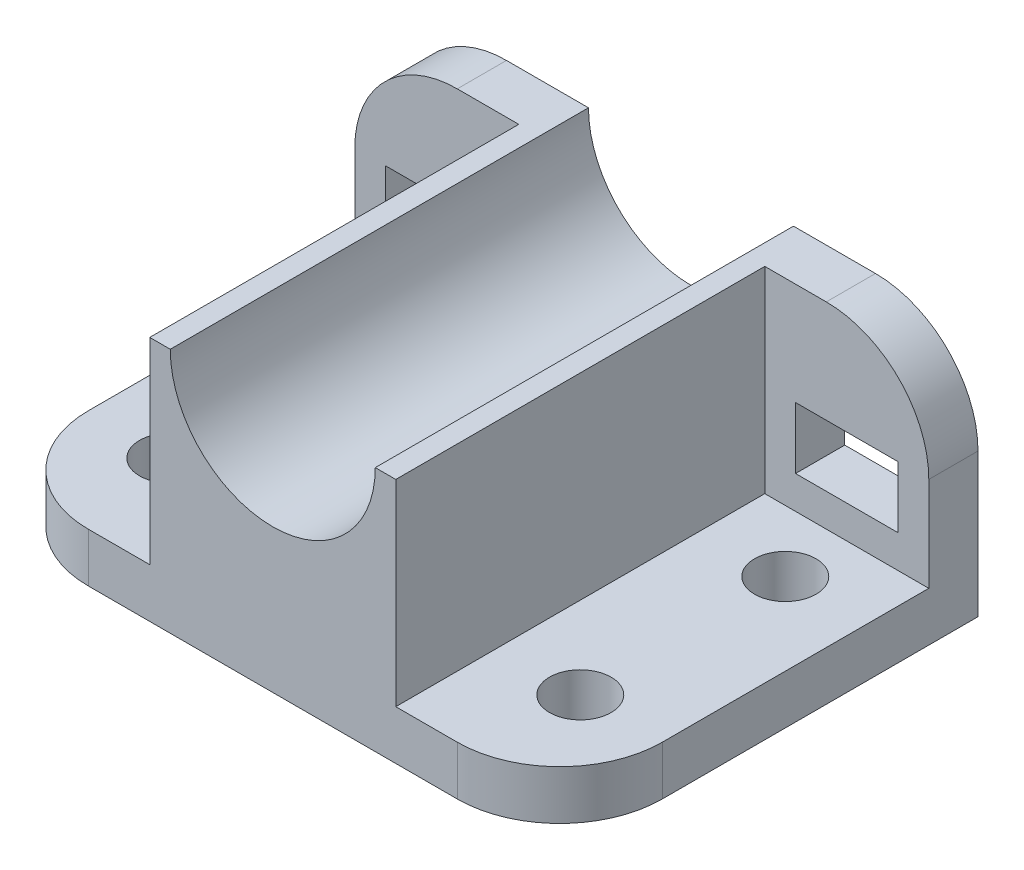
ISO-10303-21;
HEADER;
FILE_DESCRIPTION(('STEP AP214'),'2;1');
FILE_NAME('part.step','',(''),(''),'','','');
FILE_SCHEMA(('AUTOMOTIVE_DESIGN { 1 0 10303 214 1 1 1 1 }'));
ENDSEC;
DATA;
#1=APPLICATION_CONTEXT('core data for automotive mechanical design processes');
#2=APPLICATION_PROTOCOL_DEFINITION('international standard','automotive_design',2000,#1);
#3=PRODUCT_CONTEXT('',#1,'mechanical');
#4=PRODUCT('Part','Part','',(#3));
#5=PRODUCT_RELATED_PRODUCT_CATEGORY('part','',(#4));
#6=PRODUCT_DEFINITION_FORMATION('','',#4);
#7=PRODUCT_DEFINITION_CONTEXT('part definition',#1,'design');
#8=PRODUCT_DEFINITION('design','',#6,#7);
#9=PRODUCT_DEFINITION_SHAPE('','',#8);
#10=(LENGTH_UNIT() NAMED_UNIT(*) SI_UNIT(.MILLI.,.METRE.));
#11=(NAMED_UNIT(*) PLANE_ANGLE_UNIT() SI_UNIT($,.RADIAN.));
#12=(NAMED_UNIT(*) SI_UNIT($,.STERADIAN.) SOLID_ANGLE_UNIT());
#13=UNCERTAINTY_MEASURE_WITH_UNIT(LENGTH_MEASURE(1.E-05),#10,'distance_accuracy_value','');
#14=(GEOMETRIC_REPRESENTATION_CONTEXT(3) GLOBAL_UNCERTAINTY_ASSIGNED_CONTEXT((#13)) GLOBAL_UNIT_ASSIGNED_CONTEXT((#10,
#11,#12)) REPRESENTATION_CONTEXT('',''));
#15=CARTESIAN_POINT('',(0.,0.,0.));
#16=DIRECTION('',(0.,0.,1.));
#17=DIRECTION('',(1.,0.,0.));
#18=AXIS2_PLACEMENT_3D('',#15,#16,#17);
#19=CARTESIAN_POINT('',(30.,12.,12.));
#20=DIRECTION('',(0.,-1.,0.));
#21=DIRECTION('',(0.,0.,-1.));
#22=AXIS2_PLACEMENT_3D('',#19,#20,#21);
#23=PLANE('',#22);
#24=DIRECTION('',(1.,0.,0.));
#25=VECTOR('',#24,1.);
#26=CARTESIAN_POINT('',(30.,12.,102.));
#27=LINE('',#26,#25);
#28=CARTESIAN_POINT('',(30.,12.,102.));
#29=VERTEX_POINT('',#28);
#30=CARTESIAN_POINT('',(45.,12.,102.));
#31=VERTEX_POINT('',#30);
#32=EDGE_CURVE('E334',#29,#31,#27,.T.);
#33=ORIENTED_EDGE('',*,*,#32,.T.);
#34=CARTESIAN_POINT('',(45.,12.,77.));
#35=DIRECTION('',(0.,-1.,0.));
#36=DIRECTION('',(0.,0.,-1.));
#37=AXIS2_PLACEMENT_3D('',#34,#35,#36);
#38=CIRCLE('',#37,25.);
#39=CARTESIAN_POINT('',(70.,12.,77.));
#40=VERTEX_POINT('',#39);
#41=EDGE_CURVE('E54',#31,#40,#38,.F.);
#42=ORIENTED_EDGE('',*,*,#41,.T.);
#43=DIRECTION('',(0.,0.,1.));
#44=VECTOR('',#43,1.);
#45=CARTESIAN_POINT('',(70.,12.,12.));
#46=LINE('',#45,#44);
#47=CARTESIAN_POINT('',(70.,12.,12.));
#48=VERTEX_POINT('',#47);
#49=EDGE_CURVE('E355',#48,#40,#46,.T.);
#50=ORIENTED_EDGE('',*,*,#49,.F.);
#51=DIRECTION('',(1.,0.,0.));
#52=VECTOR('',#51,1.);
#53=CARTESIAN_POINT('',(30.,12.,12.));
#54=LINE('',#53,#52);
#55=CARTESIAN_POINT('',(30.,12.,12.));
#56=VERTEX_POINT('',#55);
#57=EDGE_CURVE('E333',#56,#48,#54,.T.);
#58=ORIENTED_EDGE('',*,*,#57,.F.);
#59=DIRECTION('',(0.,0.,1.));
#60=VECTOR('',#59,1.);
#61=CARTESIAN_POINT('',(30.,12.,12.));
#62=LINE('',#61,#60);
#63=EDGE_CURVE('E345',#56,#29,#62,.T.);
#64=ORIENTED_EDGE('',*,*,#63,.T.);
#65=EDGE_LOOP('',(#33,#42,#50,#58,#64));
#66=FACE_BOUND('',#65,.T.);
#67=CARTESIAN_POINT('',(50.,12.,27.));
#68=DIRECTION('',(0.,1.,0.));
#69=DIRECTION('',(0.,0.,1.));
#70=AXIS2_PLACEMENT_3D('',#67,#68,#69);
#71=CIRCLE('',#70,7.50000000000001);
#72=CARTESIAN_POINT('',(50.,12.,34.5));
#73=VERTEX_POINT('',#72);
#74=EDGE_CURVE('E631',#73,#73,#71,.T.);
#75=ORIENTED_EDGE('',*,*,#74,.F.);
#76=EDGE_LOOP('',(#75));
#77=FACE_BOUND('',#76,.T.);
#78=CARTESIAN_POINT('',(50.,12.,77.));
#79=DIRECTION('',(0.,1.,0.));
#80=DIRECTION('',(0.,0.,1.));
#81=AXIS2_PLACEMENT_3D('',#78,#79,#80);
#82=CIRCLE('',#81,7.50000000000001);
#83=CARTESIAN_POINT('',(50.,12.,84.5));
#84=VERTEX_POINT('',#83);
#85=EDGE_CURVE('E626',#84,#84,#82,.T.);
#86=ORIENTED_EDGE('',*,*,#85,.F.);
#87=EDGE_LOOP('',(#86));
#88=FACE_BOUND('',#87,.T.);
#89=ADVANCED_FACE('F45',(#66,#77,#88),#23,.F.);
#90=CARTESIAN_POINT('',(0.,60.,0.));
#91=DIRECTION('',(0.,0.,-1.));
#92=DIRECTION('',(-1.,0.,0.));
#93=AXIS2_PLACEMENT_3D('',#90,#91,#92);
#94=PLANE('',#93);
#95=DIRECTION('',(0.,1.,0.));
#96=VECTOR('',#95,1.);
#97=CARTESIAN_POINT('',(37.5,60.,0.));
#98=LINE('',#97,#96);
#99=CARTESIAN_POINT('',(37.5,20.,0.));
#100=VERTEX_POINT('',#99);
#101=CARTESIAN_POINT('',(37.5,35.,0.));
#102=VERTEX_POINT('',#101);
#103=EDGE_CURVE('E291',#100,#102,#98,.T.);
#104=ORIENTED_EDGE('',*,*,#103,.F.);
#105=DIRECTION('',(-1.,0.,0.));
#106=VECTOR('',#105,1.);
#107=CARTESIAN_POINT('',(0.,20.,0.));
#108=LINE('',#107,#106);
#109=CARTESIAN_POINT('',(62.5,20.,0.));
#110=VERTEX_POINT('',#109);
#111=EDGE_CURVE('E272',#110,#100,#108,.T.);
#112=ORIENTED_EDGE('',*,*,#111,.F.);
#113=DIRECTION('',(0.,-1.,0.));
#114=VECTOR('',#113,1.);
#115=CARTESIAN_POINT('',(62.5,60.,0.));
#116=LINE('',#115,#114);
#117=CARTESIAN_POINT('',(62.5,35.,0.));
#118=VERTEX_POINT('',#117);
#119=EDGE_CURVE('E284',#118,#110,#116,.T.);
#120=ORIENTED_EDGE('',*,*,#119,.F.);
#121=DIRECTION('',(1.,0.,0.));
#122=VECTOR('',#121,1.);
#123=CARTESIAN_POINT('',(0.,35.,0.));
#124=LINE('',#123,#122);
#125=EDGE_CURVE('E288',#102,#118,#124,.T.);
#126=ORIENTED_EDGE('',*,*,#125,.F.);
#127=EDGE_LOOP('',(#104,#112,#120,#126));
#128=FACE_BOUND('',#127,.T.);
#129=DIRECTION('',(0.,-1.,0.));
#130=VECTOR('',#129,1.);
#131=CARTESIAN_POINT('',(-70.,60.,0.));
#132=LINE('',#131,#130);
#133=CARTESIAN_POINT('',(-70.,35.,0.));
#134=VERTEX_POINT('',#133);
#135=CARTESIAN_POINT('',(-70.,0.,0.));
#136=VERTEX_POINT('',#135);
#137=EDGE_CURVE('E354',#134,#136,#132,.T.);
#138=ORIENTED_EDGE('',*,*,#137,.F.);
#139=CARTESIAN_POINT('',(-45.,35.,0.));
#140=DIRECTION('',(0.,0.,-1.));
#141=DIRECTION('',(-1.,0.,0.));
#142=AXIS2_PLACEMENT_3D('',#139,#140,#141);
#143=CIRCLE('',#142,25.);
#144=CARTESIAN_POINT('',(-45.,60.,0.));
#145=VERTEX_POINT('',#144);
#146=EDGE_CURVE('E418',#134,#145,#143,.T.);
#147=ORIENTED_EDGE('',*,*,#146,.T.);
#148=DIRECTION('',(-1.,0.,0.));
#149=VECTOR('',#148,1.);
#150=CARTESIAN_POINT('',(-25.,60.,0.));
#151=LINE('',#150,#149);
#152=CARTESIAN_POINT('',(-25.,60.,0.));
#153=VERTEX_POINT('',#152);
#154=EDGE_CURVE('E367',#153,#145,#151,.T.);
#155=ORIENTED_EDGE('',*,*,#154,.F.);
#156=CARTESIAN_POINT('',(0.,60.,0.));
#157=DIRECTION('',(0.,0.,-1.));
#158=DIRECTION('',(-1.,0.,0.));
#159=AXIS2_PLACEMENT_3D('',#156,#157,#158);
#160=CIRCLE('',#159,25.);
#161=CARTESIAN_POINT('',(25.,60.,0.));
#162=VERTEX_POINT('',#161);
#163=EDGE_CURVE('E392',#162,#153,#160,.T.);
#164=ORIENTED_EDGE('',*,*,#163,.F.);
#165=DIRECTION('',(-1.,0.,0.));
#166=VECTOR('',#165,1.);
#167=CARTESIAN_POINT('',(70.,60.,0.));
#168=LINE('',#167,#166);
#169=CARTESIAN_POINT('',(45.,60.,0.));
#170=VERTEX_POINT('',#169);
#171=EDGE_CURVE('E389',#170,#162,#168,.T.);
#172=ORIENTED_EDGE('',*,*,#171,.F.);
#173=CARTESIAN_POINT('',(45.,35.,0.));
#174=DIRECTION('',(0.,0.,-1.));
#175=DIRECTION('',(-1.,0.,0.));
#176=AXIS2_PLACEMENT_3D('',#173,#174,#175);
#177=CIRCLE('',#176,25.);
#178=CARTESIAN_POINT('',(70.,35.,0.));
#179=VERTEX_POINT('',#178);
#180=EDGE_CURVE('E415',#170,#179,#177,.T.);
#181=ORIENTED_EDGE('',*,*,#180,.T.);
#182=DIRECTION('',(0.,1.,0.));
#183=VECTOR('',#182,1.);
#184=CARTESIAN_POINT('',(70.,0.,0.));
#185=LINE('',#184,#183);
#186=CARTESIAN_POINT('',(70.,0.,0.));
#187=VERTEX_POINT('',#186);
#188=EDGE_CURVE('E385',#187,#179,#185,.T.);
#189=ORIENTED_EDGE('',*,*,#188,.F.);
#190=DIRECTION('',(1.,0.,0.));
#191=VECTOR('',#190,1.);
#192=CARTESIAN_POINT('',(-70.,0.,0.));
#193=LINE('',#192,#191);
#194=EDGE_CURVE('E381',#136,#187,#193,.T.);
#195=ORIENTED_EDGE('',*,*,#194,.F.);
#196=EDGE_LOOP('',(#138,#147,#155,#164,#172,#181,#189,#195));
#197=FACE_BOUND('',#196,.T.);
#198=DIRECTION('',(1.,0.,0.));
#199=VECTOR('',#198,1.);
#200=CARTESIAN_POINT('',(0.,20.,0.));
#201=LINE('',#200,#199);
#202=CARTESIAN_POINT('',(-62.5,20.,0.));
#203=VERTEX_POINT('',#202);
#204=CARTESIAN_POINT('',(-37.5,20.,0.));
#205=VERTEX_POINT('',#204);
#206=EDGE_CURVE('E245',#203,#205,#201,.T.);
#207=ORIENTED_EDGE('',*,*,#206,.T.);
#208=DIRECTION('',(0.,1.,0.));
#209=VECTOR('',#208,1.);
#210=CARTESIAN_POINT('',(-37.5,60.,0.));
#211=LINE('',#210,#209);
#212=CARTESIAN_POINT('',(-37.5,35.,0.));
#213=VERTEX_POINT('',#212);
#214=EDGE_CURVE('E249',#205,#213,#211,.T.);
#215=ORIENTED_EDGE('',*,*,#214,.T.);
#216=DIRECTION('',(-1.,0.,0.));
#217=VECTOR('',#216,1.);
#218=CARTESIAN_POINT('',(0.,35.,0.));
#219=LINE('',#218,#217);
#220=CARTESIAN_POINT('',(-62.5,35.,0.));
#221=VERTEX_POINT('',#220);
#222=EDGE_CURVE('E236',#213,#221,#219,.T.);
#223=ORIENTED_EDGE('',*,*,#222,.T.);
#224=DIRECTION('',(0.,-1.,0.));
#225=VECTOR('',#224,1.);
#226=CARTESIAN_POINT('',(-62.5,60.,0.));
#227=LINE('',#226,#225);
#228=EDGE_CURVE('E212',#221,#203,#227,.T.);
#229=ORIENTED_EDGE('',*,*,#228,.T.);
#230=EDGE_LOOP('',(#207,#215,#223,#229));
#231=FACE_BOUND('',#230,.T.);
#232=ADVANCED_FACE('F488',(#128,#197,#231),#94,.T.);
#233=CARTESIAN_POINT('',(0.,0.,12.));
#234=DIRECTION('',(0.,0.,1.));
#235=DIRECTION('',(-1.,0.,0.));
#236=AXIS2_PLACEMENT_3D('',#233,#234,#235);
#237=PLANE('',#236);
#238=DIRECTION('',(1.,0.,0.));
#239=VECTOR('',#238,1.);
#240=CARTESIAN_POINT('',(-30.,60.,12.));
#241=LINE('',#240,#239);
#242=CARTESIAN_POINT('',(-45.,60.,12.));
#243=VERTEX_POINT('',#242);
#244=CARTESIAN_POINT('',(-30.,60.,12.));
#245=VERTEX_POINT('',#244);
#246=EDGE_CURVE('E299',#243,#245,#241,.T.);
#247=ORIENTED_EDGE('',*,*,#246,.F.);
#248=CARTESIAN_POINT('',(-45.,35.,12.));
#249=DIRECTION('',(0.,0.,1.));
#250=DIRECTION('',(1.,0.,0.));
#251=AXIS2_PLACEMENT_3D('',#248,#249,#250);
#252=CIRCLE('',#251,25.);
#253=CARTESIAN_POINT('',(-70.,35.,12.));
#254=VERTEX_POINT('',#253);
#255=EDGE_CURVE('E424',#243,#254,#252,.T.);
#256=ORIENTED_EDGE('',*,*,#255,.T.);
#257=DIRECTION('',(0.,1.,0.));
#258=VECTOR('',#257,1.);
#259=CARTESIAN_POINT('',(-70.,60.,12.));
#260=LINE('',#259,#258);
#261=CARTESIAN_POINT('',(-70.,12.,12.));
#262=VERTEX_POINT('',#261);
#263=EDGE_CURVE('E303',#262,#254,#260,.T.);
#264=ORIENTED_EDGE('',*,*,#263,.F.);
#265=DIRECTION('',(-1.,0.,0.));
#266=VECTOR('',#265,1.);
#267=CARTESIAN_POINT('',(-30.,12.,12.));
#268=LINE('',#267,#266);
#269=CARTESIAN_POINT('',(-30.,12.,12.));
#270=VERTEX_POINT('',#269);
#271=EDGE_CURVE('E307',#270,#262,#268,.T.);
#272=ORIENTED_EDGE('',*,*,#271,.F.);
#273=DIRECTION('',(0.,-1.,0.));
#274=VECTOR('',#273,1.);
#275=CARTESIAN_POINT('',(-30.,60.,12.));
#276=LINE('',#275,#274);
#277=EDGE_CURVE('E295',#245,#270,#276,.T.);
#278=ORIENTED_EDGE('',*,*,#277,.F.);
#279=EDGE_LOOP('',(#247,#256,#264,#272,#278));
#280=FACE_BOUND('',#279,.T.);
#281=DIRECTION('',(1.,0.,0.));
#282=VECTOR('',#281,1.);
#283=CARTESIAN_POINT('',(-37.5,35.,12.));
#284=LINE('',#283,#282);
#285=CARTESIAN_POINT('',(-62.5,35.,12.));
#286=VERTEX_POINT('',#285);
#287=CARTESIAN_POINT('',(-37.5,35.,12.));
#288=VERTEX_POINT('',#287);
#289=EDGE_CURVE('E219',#286,#288,#284,.T.);
#290=ORIENTED_EDGE('',*,*,#289,.T.);
#291=DIRECTION('',(0.,-1.,0.));
#292=VECTOR('',#291,1.);
#293=CARTESIAN_POINT('',(-37.5,35.,12.));
#294=LINE('',#293,#292);
#295=CARTESIAN_POINT('',(-37.5,20.,12.));
#296=VERTEX_POINT('',#295);
#297=EDGE_CURVE('E69',#288,#296,#294,.T.);
#298=ORIENTED_EDGE('',*,*,#297,.T.);
#299=DIRECTION('',(-1.,0.,0.));
#300=VECTOR('',#299,1.);
#301=CARTESIAN_POINT('',(-37.5,20.,12.));
#302=LINE('',#301,#300);
#303=CARTESIAN_POINT('',(-62.5,20.,12.));
#304=VERTEX_POINT('',#303);
#305=EDGE_CURVE('E226',#296,#304,#302,.T.);
#306=ORIENTED_EDGE('',*,*,#305,.T.);
#307=DIRECTION('',(0.,1.,0.));
#308=VECTOR('',#307,1.);
#309=CARTESIAN_POINT('',(-62.5,35.,12.));
#310=LINE('',#309,#308);
#311=EDGE_CURVE('E209',#304,#286,#310,.T.);
#312=ORIENTED_EDGE('',*,*,#311,.T.);
#313=EDGE_LOOP('',(#290,#298,#306,#312));
#314=FACE_BOUND('',#313,.T.);
#315=ADVANCED_FACE('F224',(#280,#314),#237,.T.);
#316=CARTESIAN_POINT('',(-70.,60.,102.));
#317=DIRECTION('',(1.,0.,0.));
#318=DIRECTION('',(0.,1.,0.));
#319=AXIS2_PLACEMENT_3D('',#316,#317,#318);
#320=PLANE('',#319);
#321=DIRECTION('',(0.,0.,-1.));
#322=VECTOR('',#321,1.);
#323=CARTESIAN_POINT('',(-70.,0.,102.));
#324=LINE('',#323,#322);
#325=CARTESIAN_POINT('',(-70.,0.,77.));
#326=VERTEX_POINT('',#325);
#327=EDGE_CURVE('E408',#326,#136,#324,.T.);
#328=ORIENTED_EDGE('',*,*,#327,.F.);
#329=DIRECTION('',(0.,-1.,0.));
#330=VECTOR('',#329,1.);
#331=CARTESIAN_POINT('',(-70.,60.,77.));
#332=LINE('',#331,#330);
#333=CARTESIAN_POINT('',(-70.,12.,77.));
#334=VERTEX_POINT('',#333);
#335=EDGE_CURVE('E451',#326,#334,#332,.F.);
#336=ORIENTED_EDGE('',*,*,#335,.T.);
#337=DIRECTION('',(0.,0.,1.));
#338=VECTOR('',#337,1.);
#339=CARTESIAN_POINT('',(-70.,12.,12.));
#340=LINE('',#339,#338);
#341=EDGE_CURVE('E322',#262,#334,#340,.T.);
#342=ORIENTED_EDGE('',*,*,#341,.F.);
#343=ORIENTED_EDGE('',*,*,#263,.T.);
#344=DIRECTION('',(0.,0.,-1.));
#345=VECTOR('',#344,1.);
#346=CARTESIAN_POINT('',(-70.,35.,102.));
#347=LINE('',#346,#345);
#348=EDGE_CURVE('E411',#254,#134,#347,.T.);
#349=ORIENTED_EDGE('',*,*,#348,.T.);
#350=ORIENTED_EDGE('',*,*,#137,.T.);
#351=EDGE_LOOP('',(#328,#336,#342,#343,#349,#350));
#352=FACE_BOUND('',#351,.T.);
#353=ADVANCED_FACE('F481',(#352),#320,.F.);
#354=CARTESIAN_POINT('',(-25.,60.,102.));
#355=DIRECTION('',(0.,-1.,0.));
#356=DIRECTION('',(0.,0.,-1.));
#357=AXIS2_PLACEMENT_3D('',#354,#355,#356);
#358=PLANE('',#357);
#359=ORIENTED_EDGE('',*,*,#154,.T.);
#360=DIRECTION('',(0.,0.,-1.));
#361=VECTOR('',#360,1.);
#362=CARTESIAN_POINT('',(-45.,60.,102.));
#363=LINE('',#362,#361);
#364=EDGE_CURVE('E421',#145,#243,#363,.F.);
#365=ORIENTED_EDGE('',*,*,#364,.T.);
#366=ORIENTED_EDGE('',*,*,#246,.T.);
#367=DIRECTION('',(0.,0.,1.));
#368=VECTOR('',#367,1.);
#369=CARTESIAN_POINT('',(-30.,60.,12.));
#370=LINE('',#369,#368);
#371=CARTESIAN_POINT('',(-30.,60.,102.));
#372=VERTEX_POINT('',#371);
#373=EDGE_CURVE('E310',#245,#372,#370,.T.);
#374=ORIENTED_EDGE('',*,*,#373,.T.);
#375=DIRECTION('',(-1.,0.,0.));
#376=VECTOR('',#375,1.);
#377=CARTESIAN_POINT('',(-25.,60.,102.));
#378=LINE('',#377,#376);
#379=CARTESIAN_POINT('',(-25.,60.,102.));
#380=VERTEX_POINT('',#379);
#381=EDGE_CURVE('E373',#380,#372,#378,.T.);
#382=ORIENTED_EDGE('',*,*,#381,.F.);
#383=DIRECTION('',(0.,0.,-1.));
#384=VECTOR('',#383,1.);
#385=CARTESIAN_POINT('',(-25.,60.,102.));
#386=LINE('',#385,#384);
#387=EDGE_CURVE('E377',#380,#153,#386,.T.);
#388=ORIENTED_EDGE('',*,*,#387,.T.);
#389=EDGE_LOOP('',(#359,#365,#366,#374,#382,#388));
#390=FACE_BOUND('',#389,.T.);
#391=ADVANCED_FACE('F516',(#390),#358,.F.);
#392=CARTESIAN_POINT('',(0.,60.,102.));
#393=DIRECTION('',(0.,0.,-1.));
#394=DIRECTION('',(-1.,0.,0.));
#395=AXIS2_PLACEMENT_3D('',#392,#393,#394);
#396=PLANE('',#395);
#397=DIRECTION('',(-1.,0.,0.));
#398=VECTOR('',#397,1.);
#399=CARTESIAN_POINT('',(-30.,12.,102.));
#400=LINE('',#399,#398);
#401=CARTESIAN_POINT('',(-30.,12.,102.));
#402=VERTEX_POINT('',#401);
#403=CARTESIAN_POINT('',(-45.,12.,102.));
#404=VERTEX_POINT('',#403);
#405=EDGE_CURVE('E300',#402,#404,#400,.T.);
#406=ORIENTED_EDGE('',*,*,#405,.T.);
#407=DIRECTION('',(0.,-1.,0.));
#408=VECTOR('',#407,1.);
#409=CARTESIAN_POINT('',(-45.,60.,102.));
#410=LINE('',#409,#408);
#411=CARTESIAN_POINT('',(-45.,0.,102.));
#412=VERTEX_POINT('',#411);
#413=EDGE_CURVE('E441',#404,#412,#410,.T.);
#414=ORIENTED_EDGE('',*,*,#413,.T.);
#415=DIRECTION('',(1.,0.,0.));
#416=VECTOR('',#415,1.);
#417=CARTESIAN_POINT('',(-70.,0.,102.));
#418=LINE('',#417,#416);
#419=CARTESIAN_POINT('',(45.,0.,102.));
#420=VERTEX_POINT('',#419);
#421=EDGE_CURVE('E362',#412,#420,#418,.T.);
#422=ORIENTED_EDGE('',*,*,#421,.T.);
#423=DIRECTION('',(0.,1.,0.));
#424=VECTOR('',#423,1.);
#425=CARTESIAN_POINT('',(45.,60.,102.));
#426=LINE('',#425,#424);
#427=EDGE_CURVE('E437',#420,#31,#426,.T.);
#428=ORIENTED_EDGE('',*,*,#427,.T.);
#429=ORIENTED_EDGE('',*,*,#32,.F.);
#430=DIRECTION('',(0.,-1.,0.));
#431=VECTOR('',#430,1.);
#432=CARTESIAN_POINT('',(30.,60.,102.));
#433=LINE('',#432,#431);
#434=CARTESIAN_POINT('',(30.,60.,102.));
#435=VERTEX_POINT('',#434);
#436=EDGE_CURVE('E321',#435,#29,#433,.T.);
#437=ORIENTED_EDGE('',*,*,#436,.F.);
#438=DIRECTION('',(-1.,0.,0.));
#439=VECTOR('',#438,1.);
#440=CARTESIAN_POINT('',(70.,60.,102.));
#441=LINE('',#440,#439);
#442=CARTESIAN_POINT('',(25.,60.,102.));
#443=VERTEX_POINT('',#442);
#444=EDGE_CURVE('E366',#435,#443,#441,.T.);
#445=ORIENTED_EDGE('',*,*,#444,.T.);
#446=CARTESIAN_POINT('',(0.,60.,102.));
#447=DIRECTION('',(0.,0.,-1.));
#448=DIRECTION('',(-1.,0.,0.));
#449=AXIS2_PLACEMENT_3D('',#446,#447,#448);
#450=CIRCLE('',#449,25.);
#451=EDGE_CURVE('E370',#443,#380,#450,.T.);
#452=ORIENTED_EDGE('',*,*,#451,.T.);
#453=ORIENTED_EDGE('',*,*,#381,.T.);
#454=DIRECTION('',(0.,-1.,0.));
#455=VECTOR('',#454,1.);
#456=CARTESIAN_POINT('',(-30.,60.,102.));
#457=LINE('',#456,#455);
#458=EDGE_CURVE('E294',#372,#402,#457,.T.);
#459=ORIENTED_EDGE('',*,*,#458,.T.);
#460=EDGE_LOOP('',(#406,#414,#422,#428,#429,#437,#445,#452,#453,#459));
#461=FACE_BOUND('',#460,.T.);
#462=ADVANCED_FACE('F473',(#461),#396,.F.);
#463=CARTESIAN_POINT('',(-70.,0.,102.));
#464=DIRECTION('',(0.,1.,0.));
#465=DIRECTION('',(0.,0.,1.));
#466=AXIS2_PLACEMENT_3D('',#463,#464,#465);
#467=PLANE('',#466);
#468=CARTESIAN_POINT('',(50.,0.,77.));
#469=DIRECTION('',(0.,1.,0.));
#470=DIRECTION('',(0.,0.,1.));
#471=AXIS2_PLACEMENT_3D('',#468,#469,#470);
#472=CIRCLE('',#471,7.50000000000001);
#473=CARTESIAN_POINT('',(50.,0.,84.5));
#474=VERTEX_POINT('',#473);
#475=EDGE_CURVE('E623',#474,#474,#472,.T.);
#476=ORIENTED_EDGE('',*,*,#475,.T.);
#477=EDGE_LOOP('',(#476));
#478=FACE_BOUND('',#477,.T.);
#479=CARTESIAN_POINT('',(50.,0.,27.));
#480=DIRECTION('',(0.,1.,0.));
#481=DIRECTION('',(0.,0.,1.));
#482=AXIS2_PLACEMENT_3D('',#479,#480,#481);
#483=CIRCLE('',#482,7.50000000000001);
#484=CARTESIAN_POINT('',(50.,0.,34.5));
#485=VERTEX_POINT('',#484);
#486=EDGE_CURVE('E637',#485,#485,#483,.T.);
#487=ORIENTED_EDGE('',*,*,#486,.T.);
#488=EDGE_LOOP('',(#487));
#489=FACE_BOUND('',#488,.T.);
#490=CARTESIAN_POINT('',(-50.,0.,27.));
#491=DIRECTION('',(0.,1.,0.));
#492=DIRECTION('',(0.,0.,1.));
#493=AXIS2_PLACEMENT_3D('',#490,#491,#492);
#494=CIRCLE('',#493,7.50000000000001);
#495=CARTESIAN_POINT('',(-50.,0.,34.5));
#496=VERTEX_POINT('',#495);
#497=EDGE_CURVE('E645',#496,#496,#494,.T.);
#498=ORIENTED_EDGE('',*,*,#497,.T.);
#499=EDGE_LOOP('',(#498));
#500=FACE_BOUND('',#499,.T.);
#501=CARTESIAN_POINT('',(-50.,0.,77.));
#502=DIRECTION('',(0.,1.,0.));
#503=DIRECTION('',(0.,0.,1.));
#504=AXIS2_PLACEMENT_3D('',#501,#502,#503);
#505=CIRCLE('',#504,7.50000000000001);
#506=CARTESIAN_POINT('',(-50.,0.,84.5));
#507=VERTEX_POINT('',#506);
#508=EDGE_CURVE('E653',#507,#507,#505,.T.);
#509=ORIENTED_EDGE('',*,*,#508,.T.);
#510=EDGE_LOOP('',(#509));
#511=FACE_BOUND('',#510,.T.);
#512=ORIENTED_EDGE('',*,*,#421,.F.);
#513=CARTESIAN_POINT('',(-45.,0.,77.));
#514=DIRECTION('',(0.,1.,0.));
#515=DIRECTION('',(0.,0.,1.));
#516=AXIS2_PLACEMENT_3D('',#513,#514,#515);
#517=CIRCLE('',#516,25.);
#518=EDGE_CURVE('E448',#412,#326,#517,.F.);
#519=ORIENTED_EDGE('',*,*,#518,.T.);
#520=ORIENTED_EDGE('',*,*,#327,.T.);
#521=ORIENTED_EDGE('',*,*,#194,.T.);
#522=DIRECTION('',(0.,0.,-1.));
#523=VECTOR('',#522,1.);
#524=CARTESIAN_POINT('',(70.,0.,102.));
#525=LINE('',#524,#523);
#526=CARTESIAN_POINT('',(70.,0.,77.));
#527=VERTEX_POINT('',#526);
#528=EDGE_CURVE('E405',#527,#187,#525,.T.);
#529=ORIENTED_EDGE('',*,*,#528,.F.);
#530=CARTESIAN_POINT('',(45.,0.,77.));
#531=DIRECTION('',(0.,1.,0.));
#532=DIRECTION('',(0.,0.,1.));
#533=AXIS2_PLACEMENT_3D('',#530,#531,#532);
#534=CIRCLE('',#533,25.);
#535=EDGE_CURVE('E445',#527,#420,#534,.F.);
#536=ORIENTED_EDGE('',*,*,#535,.T.);
#537=EDGE_LOOP('',(#512,#519,#520,#521,#529,#536));
#538=FACE_BOUND('',#537,.T.);
#539=ADVANCED_FACE('F471',(#478,#489,#500,#511,#538),#467,.F.);
#540=CARTESIAN_POINT('',(70.,0.,102.));
#541=DIRECTION('',(-1.,0.,0.));
#542=DIRECTION('',(0.,-1.,0.));
#543=AXIS2_PLACEMENT_3D('',#540,#541,#542);
#544=PLANE('',#543);
#545=ORIENTED_EDGE('',*,*,#49,.T.);
#546=DIRECTION('',(0.,1.,0.));
#547=VECTOR('',#546,1.);
#548=CARTESIAN_POINT('',(70.,0.,77.));
#549=LINE('',#548,#547);
#550=EDGE_CURVE('E11',#40,#527,#549,.F.);
#551=ORIENTED_EDGE('',*,*,#550,.T.);
#552=ORIENTED_EDGE('',*,*,#528,.T.);
#553=ORIENTED_EDGE('',*,*,#188,.T.);
#554=DIRECTION('',(0.,0.,-1.));
#555=VECTOR('',#554,1.);
#556=CARTESIAN_POINT('',(70.,35.,102.));
#557=LINE('',#556,#555);
#558=CARTESIAN_POINT('',(70.,35.,12.));
#559=VERTEX_POINT('',#558);
#560=EDGE_CURVE('E431',#179,#559,#557,.F.);
#561=ORIENTED_EDGE('',*,*,#560,.T.);
#562=DIRECTION('',(0.,1.,0.));
#563=VECTOR('',#562,1.);
#564=CARTESIAN_POINT('',(70.,60.,12.));
#565=LINE('',#564,#563);
#566=EDGE_CURVE('E338',#48,#559,#565,.T.);
#567=ORIENTED_EDGE('',*,*,#566,.F.);
#568=EDGE_LOOP('',(#545,#551,#552,#553,#561,#567));
#569=FACE_BOUND('',#568,.T.);
#570=ADVANCED_FACE('F466',(#569),#544,.F.);
#571=CARTESIAN_POINT('',(70.,60.,102.));
#572=DIRECTION('',(0.,-1.,0.));
#573=DIRECTION('',(0.,0.,-1.));
#574=AXIS2_PLACEMENT_3D('',#571,#572,#573);
#575=PLANE('',#574);
#576=DIRECTION('',(-1.,0.,0.));
#577=VECTOR('',#576,1.);
#578=CARTESIAN_POINT('',(30.,60.,12.));
#579=LINE('',#578,#577);
#580=CARTESIAN_POINT('',(45.,60.,12.));
#581=VERTEX_POINT('',#580);
#582=CARTESIAN_POINT('',(30.,60.,12.));
#583=VERTEX_POINT('',#582);
#584=EDGE_CURVE('E342',#581,#583,#579,.T.);
#585=ORIENTED_EDGE('',*,*,#584,.F.);
#586=DIRECTION('',(0.,0.,-1.));
#587=VECTOR('',#586,1.);
#588=CARTESIAN_POINT('',(45.,60.,102.));
#589=LINE('',#588,#587);
#590=EDGE_CURVE('E427',#581,#170,#589,.T.);
#591=ORIENTED_EDGE('',*,*,#590,.T.);
#592=ORIENTED_EDGE('',*,*,#171,.T.);
#593=DIRECTION('',(0.,0.,-1.));
#594=VECTOR('',#593,1.);
#595=CARTESIAN_POINT('',(25.,60.,102.));
#596=LINE('',#595,#594);
#597=EDGE_CURVE('E401',#443,#162,#596,.T.);
#598=ORIENTED_EDGE('',*,*,#597,.F.);
#599=ORIENTED_EDGE('',*,*,#444,.F.);
#600=DIRECTION('',(0.,0.,1.));
#601=VECTOR('',#600,1.);
#602=CARTESIAN_POINT('',(30.,60.,12.));
#603=LINE('',#602,#601);
#604=EDGE_CURVE('E351',#583,#435,#603,.T.);
#605=ORIENTED_EDGE('',*,*,#604,.F.);
#606=EDGE_LOOP('',(#585,#591,#592,#598,#599,#605));
#607=FACE_BOUND('',#606,.T.);
#608=ADVANCED_FACE('F502',(#607),#575,.F.);
#609=CARTESIAN_POINT('',(0.,60.,102.));
#610=DIRECTION('',(0.,0.,-1.));
#611=DIRECTION('',(-1.,0.,0.));
#612=AXIS2_PLACEMENT_3D('',#609,#610,#611);
#613=CYLINDRICAL_SURFACE('',#612,25.);
#614=ORIENTED_EDGE('',*,*,#163,.T.);
#615=ORIENTED_EDGE('',*,*,#387,.F.);
#616=ORIENTED_EDGE('',*,*,#451,.F.);
#617=ORIENTED_EDGE('',*,*,#597,.T.);
#618=EDGE_LOOP('',(#614,#615,#616,#617));
#619=FACE_BOUND('',#618,.T.);
#620=ADVANCED_FACE('F512',(#619),#613,.F.);
#621=CARTESIAN_POINT('',(30.,60.,12.));
#622=DIRECTION('',(-1.,0.,0.));
#623=DIRECTION('',(0.,-1.,0.));
#624=AXIS2_PLACEMENT_3D('',#621,#622,#623);
#625=PLANE('',#624);
#626=ORIENTED_EDGE('',*,*,#436,.T.);
#627=ORIENTED_EDGE('',*,*,#63,.F.);
#628=DIRECTION('',(0.,-1.,0.));
#629=VECTOR('',#628,1.);
#630=CARTESIAN_POINT('',(30.,60.,12.));
#631=LINE('',#630,#629);
#632=EDGE_CURVE('E329',#583,#56,#631,.T.);
#633=ORIENTED_EDGE('',*,*,#632,.F.);
#634=ORIENTED_EDGE('',*,*,#604,.T.);
#635=EDGE_LOOP('',(#626,#627,#633,#634));
#636=FACE_BOUND('',#635,.T.);
#637=ADVANCED_FACE('F507',(#636),#625,.F.);
#638=CARTESIAN_POINT('',(0.,0.,12.));
#639=DIRECTION('',(0.,0.,1.));
#640=DIRECTION('',(1.,0.,0.));
#641=AXIS2_PLACEMENT_3D('',#638,#639,#640);
#642=PLANE('',#641);
#643=DIRECTION('',(0.,-1.,0.));
#644=VECTOR('',#643,1.);
#645=CARTESIAN_POINT('',(37.5,35.,12.));
#646=LINE('',#645,#644);
#647=CARTESIAN_POINT('',(37.5,35.,12.));
#648=VERTEX_POINT('',#647);
#649=CARTESIAN_POINT('',(37.5,20.,12.));
#650=VERTEX_POINT('',#649);
#651=EDGE_CURVE('E253',#648,#650,#646,.T.);
#652=ORIENTED_EDGE('',*,*,#651,.F.);
#653=DIRECTION('',(-1.,0.,0.));
#654=VECTOR('',#653,1.);
#655=CARTESIAN_POINT('',(37.5,35.,12.));
#656=LINE('',#655,#654);
#657=CARTESIAN_POINT('',(62.5,35.,12.));
#658=VERTEX_POINT('',#657);
#659=EDGE_CURVE('E264',#658,#648,#656,.T.);
#660=ORIENTED_EDGE('',*,*,#659,.F.);
#661=DIRECTION('',(0.,1.,0.));
#662=VECTOR('',#661,1.);
#663=CARTESIAN_POINT('',(62.5,35.,12.));
#664=LINE('',#663,#662);
#665=CARTESIAN_POINT('',(62.5,20.,12.));
#666=VERTEX_POINT('',#665);
#667=EDGE_CURVE('E260',#666,#658,#664,.T.);
#668=ORIENTED_EDGE('',*,*,#667,.F.);
#669=DIRECTION('',(1.,0.,0.));
#670=VECTOR('',#669,1.);
#671=CARTESIAN_POINT('',(37.5,20.,12.));
#672=LINE('',#671,#670);
#673=EDGE_CURVE('E256',#650,#666,#672,.T.);
#674=ORIENTED_EDGE('',*,*,#673,.F.);
#675=EDGE_LOOP('',(#652,#660,#668,#674));
#676=FACE_BOUND('',#675,.T.);
#677=ORIENTED_EDGE('',*,*,#566,.T.);
#678=CARTESIAN_POINT('',(45.,35.,12.));
#679=DIRECTION('',(0.,0.,1.));
#680=DIRECTION('',(1.,0.,0.));
#681=AXIS2_PLACEMENT_3D('',#678,#679,#680);
#682=CIRCLE('',#681,25.);
#683=EDGE_CURVE('E434',#559,#581,#682,.T.);
#684=ORIENTED_EDGE('',*,*,#683,.T.);
#685=ORIENTED_EDGE('',*,*,#584,.T.);
#686=ORIENTED_EDGE('',*,*,#632,.T.);
#687=ORIENTED_EDGE('',*,*,#57,.T.);
#688=EDGE_LOOP('',(#677,#684,#685,#686,#687));
#689=FACE_BOUND('',#688,.T.);
#690=ADVANCED_FACE('F498',(#676,#689),#642,.T.);
#691=CARTESIAN_POINT('',(-30.,60.,12.));
#692=DIRECTION('',(-1.,0.,0.));
#693=DIRECTION('',(0.,-1.,0.));
#694=AXIS2_PLACEMENT_3D('',#691,#692,#693);
#695=PLANE('',#694);
#696=ORIENTED_EDGE('',*,*,#458,.F.);
#697=ORIENTED_EDGE('',*,*,#373,.F.);
#698=ORIENTED_EDGE('',*,*,#277,.T.);
#699=DIRECTION('',(0.,0.,1.));
#700=VECTOR('',#699,1.);
#701=CARTESIAN_POINT('',(-30.,12.,12.));
#702=LINE('',#701,#700);
#703=EDGE_CURVE('E317',#270,#402,#702,.T.);
#704=ORIENTED_EDGE('',*,*,#703,.T.);
#705=EDGE_LOOP('',(#696,#697,#698,#704));
#706=FACE_BOUND('',#705,.T.);
#707=ADVANCED_FACE('F519',(#706),#695,.T.);
#708=CARTESIAN_POINT('',(-30.,12.,12.));
#709=DIRECTION('',(0.,1.,0.));
#710=DIRECTION('',(0.,0.,1.));
#711=AXIS2_PLACEMENT_3D('',#708,#709,#710);
#712=PLANE('',#711);
#713=CARTESIAN_POINT('',(-50.,12.,27.));
#714=DIRECTION('',(0.,1.,0.));
#715=DIRECTION('',(0.,0.,1.));
#716=AXIS2_PLACEMENT_3D('',#713,#714,#715);
#717=CIRCLE('',#716,7.50000000000001);
#718=CARTESIAN_POINT('',(-50.,12.,34.5));
#719=VERTEX_POINT('',#718);
#720=EDGE_CURVE('E641',#719,#719,#717,.T.);
#721=ORIENTED_EDGE('',*,*,#720,.F.);
#722=EDGE_LOOP('',(#721));
#723=FACE_BOUND('',#722,.T.);
#724=CARTESIAN_POINT('',(-50.,12.,77.));
#725=DIRECTION('',(0.,1.,0.));
#726=DIRECTION('',(0.,0.,1.));
#727=AXIS2_PLACEMENT_3D('',#724,#725,#726);
#728=CIRCLE('',#727,7.50000000000001);
#729=CARTESIAN_POINT('',(-50.,12.,84.5));
#730=VERTEX_POINT('',#729);
#731=EDGE_CURVE('E649',#730,#730,#728,.T.);
#732=ORIENTED_EDGE('',*,*,#731,.F.);
#733=EDGE_LOOP('',(#732));
#734=FACE_BOUND('',#733,.T.);
#735=ORIENTED_EDGE('',*,*,#341,.T.);
#736=CARTESIAN_POINT('',(-45.,12.,77.));
#737=DIRECTION('',(0.,1.,0.));
#738=DIRECTION('',(0.,0.,1.));
#739=AXIS2_PLACEMENT_3D('',#736,#737,#738);
#740=CIRCLE('',#739,25.);
#741=EDGE_CURVE('E454',#334,#404,#740,.T.);
#742=ORIENTED_EDGE('',*,*,#741,.T.);
#743=ORIENTED_EDGE('',*,*,#405,.F.);
#744=ORIENTED_EDGE('',*,*,#703,.F.);
#745=ORIENTED_EDGE('',*,*,#271,.T.);
#746=EDGE_LOOP('',(#735,#742,#743,#744,#745));
#747=FACE_BOUND('',#746,.T.);
#748=ADVANCED_FACE('F523',(#723,#734,#747),#712,.T.);
#749=CARTESIAN_POINT('',(-45.,35.,102.));
#750=DIRECTION('',(0.,0.,-1.));
#751=DIRECTION('',(-1.,0.,0.));
#752=AXIS2_PLACEMENT_3D('',#749,#750,#751);
#753=CYLINDRICAL_SURFACE('',#752,25.);
#754=ORIENTED_EDGE('',*,*,#255,.F.);
#755=ORIENTED_EDGE('',*,*,#364,.F.);
#756=ORIENTED_EDGE('',*,*,#146,.F.);
#757=ORIENTED_EDGE('',*,*,#348,.F.);
#758=EDGE_LOOP('',(#754,#755,#756,#757));
#759=FACE_BOUND('',#758,.T.);
#760=ADVANCED_FACE('F528',(#759),#753,.T.);
#761=CARTESIAN_POINT('',(45.,35.,102.));
#762=DIRECTION('',(0.,0.,-1.));
#763=DIRECTION('',(-1.,0.,0.));
#764=AXIS2_PLACEMENT_3D('',#761,#762,#763);
#765=CYLINDRICAL_SURFACE('',#764,25.);
#766=ORIENTED_EDGE('',*,*,#683,.F.);
#767=ORIENTED_EDGE('',*,*,#560,.F.);
#768=ORIENTED_EDGE('',*,*,#180,.F.);
#769=ORIENTED_EDGE('',*,*,#590,.F.);
#770=EDGE_LOOP('',(#766,#767,#768,#769));
#771=FACE_BOUND('',#770,.T.);
#772=ADVANCED_FACE('F494',(#771),#765,.T.);
#773=CARTESIAN_POINT('',(-45.,60.,77.));
#774=DIRECTION('',(0.,-1.,0.));
#775=DIRECTION('',(1.,0.,0.));
#776=AXIS2_PLACEMENT_3D('',#773,#774,#775);
#777=CYLINDRICAL_SURFACE('',#776,25.);
#778=ORIENTED_EDGE('',*,*,#741,.F.);
#779=ORIENTED_EDGE('',*,*,#335,.F.);
#780=ORIENTED_EDGE('',*,*,#518,.F.);
#781=ORIENTED_EDGE('',*,*,#413,.F.);
#782=EDGE_LOOP('',(#778,#779,#780,#781));
#783=FACE_BOUND('',#782,.T.);
#784=ADVANCED_FACE('F477',(#783),#777,.T.);
#785=CARTESIAN_POINT('',(45.,60.,77.));
#786=DIRECTION('',(0.,1.,0.));
#787=DIRECTION('',(-1.,0.,0.));
#788=AXIS2_PLACEMENT_3D('',#785,#786,#787);
#789=CYLINDRICAL_SURFACE('',#788,25.);
#790=ORIENTED_EDGE('',*,*,#535,.F.);
#791=ORIENTED_EDGE('',*,*,#550,.F.);
#792=ORIENTED_EDGE('',*,*,#41,.F.);
#793=ORIENTED_EDGE('',*,*,#427,.F.);
#794=EDGE_LOOP('',(#790,#791,#792,#793));
#795=FACE_BOUND('',#794,.T.);
#796=ADVANCED_FACE('F47',(#795),#789,.T.);
#797=CARTESIAN_POINT('',(37.5,35.,-78.));
#798=DIRECTION('',(-1.,0.,0.));
#799=DIRECTION('',(0.,0.,1.));
#800=AXIS2_PLACEMENT_3D('',#797,#798,#799);
#801=PLANE('',#800);
#802=ORIENTED_EDGE('',*,*,#103,.T.);
#803=DIRECTION('',(0.,0.,1.));
#804=VECTOR('',#803,1.);
#805=CARTESIAN_POINT('',(37.5,35.,-78.));
#806=LINE('',#805,#804);
#807=EDGE_CURVE('E269',#102,#648,#806,.T.);
#808=ORIENTED_EDGE('',*,*,#807,.T.);
#809=ORIENTED_EDGE('',*,*,#651,.T.);
#810=DIRECTION('',(0.,0.,1.));
#811=VECTOR('',#810,1.);
#812=CARTESIAN_POINT('',(37.5,20.,-78.));
#813=LINE('',#812,#811);
#814=EDGE_CURVE('E268',#100,#650,#813,.T.);
#815=ORIENTED_EDGE('',*,*,#814,.F.);
#816=EDGE_LOOP('',(#802,#808,#809,#815));
#817=FACE_BOUND('',#816,.T.);
#818=ADVANCED_FACE('F573',(#817),#801,.F.);
#819=CARTESIAN_POINT('',(37.5,35.,-78.));
#820=DIRECTION('',(0.,1.,0.));
#821=DIRECTION('',(0.,0.,1.));
#822=AXIS2_PLACEMENT_3D('',#819,#820,#821);
#823=PLANE('',#822);
#824=ORIENTED_EDGE('',*,*,#125,.T.);
#825=DIRECTION('',(0.,0.,1.));
#826=VECTOR('',#825,1.);
#827=CARTESIAN_POINT('',(62.5,35.,-78.));
#828=LINE('',#827,#826);
#829=EDGE_CURVE('E273',#118,#658,#828,.T.);
#830=ORIENTED_EDGE('',*,*,#829,.T.);
#831=ORIENTED_EDGE('',*,*,#659,.T.);
#832=ORIENTED_EDGE('',*,*,#807,.F.);
#833=EDGE_LOOP('',(#824,#830,#831,#832));
#834=FACE_BOUND('',#833,.T.);
#835=ADVANCED_FACE('F578',(#834),#823,.F.);
#836=CARTESIAN_POINT('',(62.5,35.,-78.));
#837=DIRECTION('',(1.,0.,0.));
#838=DIRECTION('',(0.,0.,-1.));
#839=AXIS2_PLACEMENT_3D('',#836,#837,#838);
#840=PLANE('',#839);
#841=ORIENTED_EDGE('',*,*,#119,.T.);
#842=DIRECTION('',(0.,0.,1.));
#843=VECTOR('',#842,1.);
#844=CARTESIAN_POINT('',(62.5,20.,-78.));
#845=LINE('',#844,#843);
#846=EDGE_CURVE('E276',#110,#666,#845,.T.);
#847=ORIENTED_EDGE('',*,*,#846,.T.);
#848=ORIENTED_EDGE('',*,*,#667,.T.);
#849=ORIENTED_EDGE('',*,*,#829,.F.);
#850=EDGE_LOOP('',(#841,#847,#848,#849));
#851=FACE_BOUND('',#850,.T.);
#852=ADVANCED_FACE('F583',(#851),#840,.F.);
#853=CARTESIAN_POINT('',(37.5,20.,-78.));
#854=DIRECTION('',(0.,-1.,0.));
#855=DIRECTION('',(0.,0.,-1.));
#856=AXIS2_PLACEMENT_3D('',#853,#854,#855);
#857=PLANE('',#856);
#858=ORIENTED_EDGE('',*,*,#111,.T.);
#859=ORIENTED_EDGE('',*,*,#814,.T.);
#860=ORIENTED_EDGE('',*,*,#673,.T.);
#861=ORIENTED_EDGE('',*,*,#846,.F.);
#862=EDGE_LOOP('',(#858,#859,#860,#861));
#863=FACE_BOUND('',#862,.T.);
#864=ADVANCED_FACE('F587',(#863),#857,.F.);
#865=CARTESIAN_POINT('',(-37.5,35.,-78.));
#866=DIRECTION('',(-1.,0.,0.));
#867=DIRECTION('',(0.,0.,1.));
#868=AXIS2_PLACEMENT_3D('',#865,#866,#867);
#869=PLANE('',#868);
#870=DIRECTION('',(0.,0.,1.));
#871=VECTOR('',#870,1.);
#872=CARTESIAN_POINT('',(-37.5,20.,-78.));
#873=LINE('',#872,#871);
#874=EDGE_CURVE('E233',#205,#296,#873,.T.);
#875=ORIENTED_EDGE('',*,*,#874,.T.);
#876=ORIENTED_EDGE('',*,*,#297,.F.);
#877=DIRECTION('',(0.,0.,1.));
#878=VECTOR('',#877,1.);
#879=CARTESIAN_POINT('',(-37.5,35.,-78.));
#880=LINE('',#879,#878);
#881=EDGE_CURVE('E216',#213,#288,#880,.T.);
#882=ORIENTED_EDGE('',*,*,#881,.F.);
#883=ORIENTED_EDGE('',*,*,#214,.F.);
#884=EDGE_LOOP('',(#875,#876,#882,#883));
#885=FACE_BOUND('',#884,.T.);
#886=ADVANCED_FACE('F590',(#885),#869,.T.);
#887=CARTESIAN_POINT('',(-37.5,20.,-78.));
#888=DIRECTION('',(0.,1.,0.));
#889=DIRECTION('',(0.,0.,1.));
#890=AXIS2_PLACEMENT_3D('',#887,#888,#889);
#891=PLANE('',#890);
#892=DIRECTION('',(0.,0.,1.));
#893=VECTOR('',#892,1.);
#894=CARTESIAN_POINT('',(-62.5,20.,-78.));
#895=LINE('',#894,#893);
#896=EDGE_CURVE('E215',#203,#304,#895,.T.);
#897=ORIENTED_EDGE('',*,*,#896,.T.);
#898=ORIENTED_EDGE('',*,*,#305,.F.);
#899=ORIENTED_EDGE('',*,*,#874,.F.);
#900=ORIENTED_EDGE('',*,*,#206,.F.);
#901=EDGE_LOOP('',(#897,#898,#899,#900));
#902=FACE_BOUND('',#901,.T.);
#903=ADVANCED_FACE('F596',(#902),#891,.T.);
#904=CARTESIAN_POINT('',(-62.5,35.,-78.));
#905=DIRECTION('',(1.,0.,0.));
#906=DIRECTION('',(0.,0.,-1.));
#907=AXIS2_PLACEMENT_3D('',#904,#905,#906);
#908=PLANE('',#907);
#909=DIRECTION('',(0.,0.,1.));
#910=VECTOR('',#909,1.);
#911=CARTESIAN_POINT('',(-62.5,35.,-78.));
#912=LINE('',#911,#910);
#913=EDGE_CURVE('E61',#221,#286,#912,.T.);
#914=ORIENTED_EDGE('',*,*,#913,.T.);
#915=ORIENTED_EDGE('',*,*,#311,.F.);
#916=ORIENTED_EDGE('',*,*,#896,.F.);
#917=ORIENTED_EDGE('',*,*,#228,.F.);
#918=EDGE_LOOP('',(#914,#915,#916,#917));
#919=FACE_BOUND('',#918,.T.);
#920=ADVANCED_FACE('F206',(#919),#908,.T.);
#921=CARTESIAN_POINT('',(-37.5,35.,-78.));
#922=DIRECTION('',(0.,-1.,0.));
#923=DIRECTION('',(0.,0.,-1.));
#924=AXIS2_PLACEMENT_3D('',#921,#922,#923);
#925=PLANE('',#924);
#926=ORIENTED_EDGE('',*,*,#881,.T.);
#927=ORIENTED_EDGE('',*,*,#289,.F.);
#928=ORIENTED_EDGE('',*,*,#913,.F.);
#929=ORIENTED_EDGE('',*,*,#222,.F.);
#930=EDGE_LOOP('',(#926,#927,#928,#929));
#931=FACE_BOUND('',#930,.T.);
#932=ADVANCED_FACE('F220',(#931),#925,.T.);
#933=CARTESIAN_POINT('',(-50.,12.,77.));
#934=DIRECTION('',(0.,1.,0.));
#935=DIRECTION('',(0.,0.,1.));
#936=AXIS2_PLACEMENT_3D('',#933,#934,#935);
#937=CYLINDRICAL_SURFACE('',#936,7.50000000000001);
#938=ORIENTED_EDGE('',*,*,#508,.F.);
#939=EDGE_LOOP('',(#938));
#940=FACE_BOUND('',#939,.T.);
#941=ORIENTED_EDGE('',*,*,#731,.T.);
#942=EDGE_LOOP('',(#941));
#943=FACE_BOUND('',#942,.T.);
#944=ADVANCED_FACE('F598',(#940,#943),#937,.F.);
#945=CARTESIAN_POINT('',(-50.,12.,27.));
#946=DIRECTION('',(0.,1.,0.));
#947=DIRECTION('',(0.,0.,1.));
#948=AXIS2_PLACEMENT_3D('',#945,#946,#947);
#949=CYLINDRICAL_SURFACE('',#948,7.50000000000001);
#950=ORIENTED_EDGE('',*,*,#497,.F.);
#951=EDGE_LOOP('',(#950));
#952=FACE_BOUND('',#951,.T.);
#953=ORIENTED_EDGE('',*,*,#720,.T.);
#954=EDGE_LOOP('',(#953));
#955=FACE_BOUND('',#954,.T.);
#956=ADVANCED_FACE('F606',(#952,#955),#949,.F.);
#957=CARTESIAN_POINT('',(50.,12.,27.));
#958=DIRECTION('',(0.,1.,0.));
#959=DIRECTION('',(0.,0.,1.));
#960=AXIS2_PLACEMENT_3D('',#957,#958,#959);
#961=CYLINDRICAL_SURFACE('',#960,7.50000000000001);
#962=ORIENTED_EDGE('',*,*,#486,.F.);
#963=EDGE_LOOP('',(#962));
#964=FACE_BOUND('',#963,.T.);
#965=ORIENTED_EDGE('',*,*,#74,.T.);
#966=EDGE_LOOP('',(#965));
#967=FACE_BOUND('',#966,.T.);
#968=ADVANCED_FACE('F610',(#964,#967),#961,.F.);
#969=CARTESIAN_POINT('',(50.,12.,77.));
#970=DIRECTION('',(0.,1.,0.));
#971=DIRECTION('',(0.,0.,1.));
#972=AXIS2_PLACEMENT_3D('',#969,#970,#971);
#973=CYLINDRICAL_SURFACE('',#972,7.50000000000001);
#974=ORIENTED_EDGE('',*,*,#475,.F.);
#975=EDGE_LOOP('',(#974));
#976=FACE_BOUND('',#975,.T.);
#977=ORIENTED_EDGE('',*,*,#85,.T.);
#978=EDGE_LOOP('',(#977));
#979=FACE_BOUND('',#978,.T.);
#980=ADVANCED_FACE('F614',(#976,#979),#973,.F.);
#981=CLOSED_SHELL('',(#89,#232,#315,#353,#391,#462,#539,#570,#608,#620,#637,#690,#707,#748,#760,
#772,#784,#796,#818,#835,#852,#864,#886,#903,#920,#932,#944,#956,#968,#980));
#982=MANIFOLD_SOLID_BREP('B2',#981);
#983=ADVANCED_BREP_SHAPE_REPRESENTATION('',(#18,#982),#14);
#984=SHAPE_DEFINITION_REPRESENTATION(#9,#983);
ENDSEC;
END-ISO-10303-21;
